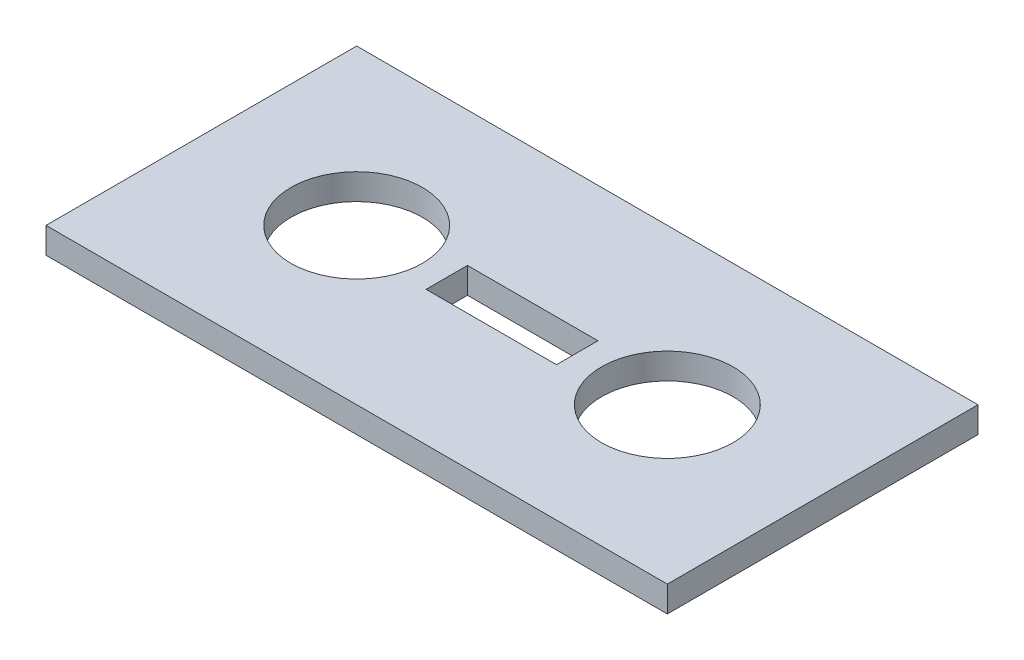
ISO-10303-21;
HEADER;
FILE_DESCRIPTION(('STEP AP214'),'2;1');
FILE_NAME('part.step','',(''),(''),'','','');
FILE_SCHEMA(('AUTOMOTIVE_DESIGN { 1 0 10303 214 1 1 1 1 }'));
ENDSEC;
DATA;
#1=APPLICATION_CONTEXT('core data for automotive mechanical design processes');
#2=APPLICATION_PROTOCOL_DEFINITION('international standard','automotive_design',2000,#1);
#3=PRODUCT_CONTEXT('',#1,'mechanical');
#4=PRODUCT('Part','Part','',(#3));
#5=PRODUCT_RELATED_PRODUCT_CATEGORY('part','',(#4));
#6=PRODUCT_DEFINITION_FORMATION('','',#4);
#7=PRODUCT_DEFINITION_CONTEXT('part definition',#1,'design');
#8=PRODUCT_DEFINITION('design','',#6,#7);
#9=PRODUCT_DEFINITION_SHAPE('','',#8);
#10=(LENGTH_UNIT() NAMED_UNIT(*) SI_UNIT(.MILLI.,.METRE.));
#11=(NAMED_UNIT(*) PLANE_ANGLE_UNIT() SI_UNIT($,.RADIAN.));
#12=(NAMED_UNIT(*) SI_UNIT($,.STERADIAN.) SOLID_ANGLE_UNIT());
#13=UNCERTAINTY_MEASURE_WITH_UNIT(LENGTH_MEASURE(1.E-05),#10,'distance_accuracy_value','');
#14=(GEOMETRIC_REPRESENTATION_CONTEXT(3) GLOBAL_UNCERTAINTY_ASSIGNED_CONTEXT((#13)) GLOBAL_UNIT_ASSIGNED_CONTEXT((#10,
#11,#12)) REPRESENTATION_CONTEXT('',''));
#15=CARTESIAN_POINT('',(0.,0.,0.));
#16=DIRECTION('',(0.,0.,1.));
#17=DIRECTION('',(1.,0.,0.));
#18=AXIS2_PLACEMENT_3D('',#15,#16,#17);
#19=CARTESIAN_POINT('',(0.,0.3175,0.254));
#20=DIRECTION('',(0.,0.,-1.));
#21=DIRECTION('',(-1.,0.,0.));
#22=AXIS2_PLACEMENT_3D('',#19,#20,#21);
#23=PLANE('',#22);
#24=DIRECTION('',(1.,0.,0.));
#25=VECTOR('',#24,1.);
#26=CARTESIAN_POINT('',(0.,0.,0.254));
#27=LINE('',#26,#25);
#28=CARTESIAN_POINT('',(-0.8,0.,0.254));
#29=VERTEX_POINT('',#28);
#30=CARTESIAN_POINT('',(0.8,0.,0.254));
#31=VERTEX_POINT('',#30);
#32=EDGE_CURVE('E169',#29,#31,#27,.T.);
#33=ORIENTED_EDGE('',*,*,#32,.F.);
#34=DIRECTION('',(0.,-1.,0.));
#35=VECTOR('',#34,1.);
#36=CARTESIAN_POINT('',(-0.8,0.3175,0.254));
#37=LINE('',#36,#35);
#38=CARTESIAN_POINT('',(-0.8,0.3175,0.254));
#39=VERTEX_POINT('',#38);
#40=EDGE_CURVE('E11',#39,#29,#37,.T.);
#41=ORIENTED_EDGE('',*,*,#40,.F.);
#42=DIRECTION('',(1.,0.,0.));
#43=VECTOR('',#42,1.);
#44=CARTESIAN_POINT('',(0.,0.3175,0.254));
#45=LINE('',#44,#43);
#46=CARTESIAN_POINT('',(0.8,0.3175,0.254));
#47=VERTEX_POINT('',#46);
#48=EDGE_CURVE('E140',#39,#47,#45,.T.);
#49=ORIENTED_EDGE('',*,*,#48,.T.);
#50=DIRECTION('',(0.,-1.,0.));
#51=VECTOR('',#50,1.);
#52=CARTESIAN_POINT('',(0.8,0.3175,0.254));
#53=LINE('',#52,#51);
#54=EDGE_CURVE('E98',#47,#31,#53,.T.);
#55=ORIENTED_EDGE('',*,*,#54,.T.);
#56=EDGE_LOOP('',(#33,#41,#49,#55));
#57=FACE_BOUND('',#56,.T.);
#58=ADVANCED_FACE('F43',(#57),#23,.T.);
#59=CARTESIAN_POINT('',(-0.8,0.3175,0.));
#60=DIRECTION('',(1.,0.,0.));
#61=DIRECTION('',(0.,0.,-1.));
#62=AXIS2_PLACEMENT_3D('',#59,#60,#61);
#63=PLANE('',#62);
#64=DIRECTION('',(0.,0.,1.));
#65=VECTOR('',#64,1.);
#66=CARTESIAN_POINT('',(-0.8,0.,0.));
#67=LINE('',#66,#65);
#68=CARTESIAN_POINT('',(-0.8,0.,-0.254));
#69=VERTEX_POINT('',#68);
#70=EDGE_CURVE('E128',#69,#29,#67,.T.);
#71=ORIENTED_EDGE('',*,*,#70,.F.);
#72=DIRECTION('',(0.,-1.,0.));
#73=VECTOR('',#72,1.);
#74=CARTESIAN_POINT('',(-0.8,0.3175,-0.254));
#75=LINE('',#74,#73);
#76=CARTESIAN_POINT('',(-0.8,0.3175,-0.254));
#77=VERTEX_POINT('',#76);
#78=EDGE_CURVE('E54',#77,#69,#75,.T.);
#79=ORIENTED_EDGE('',*,*,#78,.F.);
#80=DIRECTION('',(0.,0.,1.));
#81=VECTOR('',#80,1.);
#82=CARTESIAN_POINT('',(-0.8,0.3175,0.));
#83=LINE('',#82,#81);
#84=EDGE_CURVE('E126',#77,#39,#83,.T.);
#85=ORIENTED_EDGE('',*,*,#84,.T.);
#86=ORIENTED_EDGE('',*,*,#40,.T.);
#87=EDGE_LOOP('',(#71,#79,#85,#86));
#88=FACE_BOUND('',#87,.T.);
#89=ADVANCED_FACE('F124',(#88),#63,.T.);
#90=CARTESIAN_POINT('',(0.,0.3175,-0.254));
#91=DIRECTION('',(0.,0.,-1.));
#92=DIRECTION('',(-1.,0.,0.));
#93=AXIS2_PLACEMENT_3D('',#90,#91,#92);
#94=PLANE('',#93);
#95=DIRECTION('',(1.,0.,0.));
#96=VECTOR('',#95,1.);
#97=CARTESIAN_POINT('',(0.,0.,-0.254));
#98=LINE('',#97,#96);
#99=CARTESIAN_POINT('',(0.8,0.,-0.254));
#100=VERTEX_POINT('',#99);
#101=EDGE_CURVE('E174',#69,#100,#98,.T.);
#102=ORIENTED_EDGE('',*,*,#101,.T.);
#103=DIRECTION('',(0.,-1.,0.));
#104=VECTOR('',#103,1.);
#105=CARTESIAN_POINT('',(0.8,0.3175,-0.254));
#106=LINE('',#105,#104);
#107=CARTESIAN_POINT('',(0.8,0.3175,-0.254));
#108=VERTEX_POINT('',#107);
#109=EDGE_CURVE('E132',#108,#100,#106,.T.);
#110=ORIENTED_EDGE('',*,*,#109,.F.);
#111=DIRECTION('',(1.,0.,0.));
#112=VECTOR('',#111,1.);
#113=CARTESIAN_POINT('',(0.,0.3175,-0.254));
#114=LINE('',#113,#112);
#115=EDGE_CURVE('E135',#77,#108,#114,.T.);
#116=ORIENTED_EDGE('',*,*,#115,.F.);
#117=ORIENTED_EDGE('',*,*,#78,.T.);
#118=EDGE_LOOP('',(#102,#110,#116,#117));
#119=FACE_BOUND('',#118,.T.);
#120=ADVANCED_FACE('F136',(#119),#94,.F.);
#121=CARTESIAN_POINT('',(0.,0.3175,1.905));
#122=DIRECTION('',(0.,0.,-1.));
#123=DIRECTION('',(-1.,0.,0.));
#124=AXIS2_PLACEMENT_3D('',#121,#122,#123);
#125=PLANE('',#124);
#126=DIRECTION('',(1.,0.,0.));
#127=VECTOR('',#126,1.);
#128=CARTESIAN_POINT('',(0.,0.,1.905));
#129=LINE('',#128,#127);
#130=CARTESIAN_POINT('',(-3.81,0.,1.905));
#131=VERTEX_POINT('',#130);
#132=CARTESIAN_POINT('',(3.81,0.,1.905));
#133=VERTEX_POINT('',#132);
#134=EDGE_CURVE('E152',#131,#133,#129,.T.);
#135=ORIENTED_EDGE('',*,*,#134,.T.);
#136=DIRECTION('',(0.,-1.,0.));
#137=VECTOR('',#136,1.);
#138=CARTESIAN_POINT('',(3.81,0.3175,1.905));
#139=LINE('',#138,#137);
#140=CARTESIAN_POINT('',(3.81,0.3175,1.905));
#141=VERTEX_POINT('',#140);
#142=EDGE_CURVE('E181',#141,#133,#139,.T.);
#143=ORIENTED_EDGE('',*,*,#142,.F.);
#144=DIRECTION('',(1.,0.,0.));
#145=VECTOR('',#144,1.);
#146=CARTESIAN_POINT('',(0.,0.3175,1.905));
#147=LINE('',#146,#145);
#148=CARTESIAN_POINT('',(-3.81,0.3175,1.905));
#149=VERTEX_POINT('',#148);
#150=EDGE_CURVE('E106',#149,#141,#147,.T.);
#151=ORIENTED_EDGE('',*,*,#150,.F.);
#152=DIRECTION('',(0.,-1.,0.));
#153=VECTOR('',#152,1.);
#154=CARTESIAN_POINT('',(-3.81,0.3175,1.905));
#155=LINE('',#154,#153);
#156=EDGE_CURVE('E151',#149,#131,#155,.T.);
#157=ORIENTED_EDGE('',*,*,#156,.T.);
#158=EDGE_LOOP('',(#135,#143,#151,#157));
#159=FACE_BOUND('',#158,.T.);
#160=ADVANCED_FACE('F45',(#159),#125,.F.);
#161=CARTESIAN_POINT('',(3.81,0.3175,0.));
#162=DIRECTION('',(1.,0.,0.));
#163=DIRECTION('',(0.,0.,-1.));
#164=AXIS2_PLACEMENT_3D('',#161,#162,#163);
#165=PLANE('',#164);
#166=DIRECTION('',(0.,0.,1.));
#167=VECTOR('',#166,1.);
#168=CARTESIAN_POINT('',(3.81,0.,0.));
#169=LINE('',#168,#167);
#170=CARTESIAN_POINT('',(3.81,0.,-1.905));
#171=VERTEX_POINT('',#170);
#172=EDGE_CURVE('E156',#171,#133,#169,.T.);
#173=ORIENTED_EDGE('',*,*,#172,.F.);
#174=DIRECTION('',(0.,-1.,0.));
#175=VECTOR('',#174,1.);
#176=CARTESIAN_POINT('',(3.81,0.3175,-1.905));
#177=LINE('',#176,#175);
#178=CARTESIAN_POINT('',(3.81,0.3175,-1.905));
#179=VERTEX_POINT('',#178);
#180=EDGE_CURVE('E189',#179,#171,#177,.T.);
#181=ORIENTED_EDGE('',*,*,#180,.F.);
#182=DIRECTION('',(0.,0.,1.));
#183=VECTOR('',#182,1.);
#184=CARTESIAN_POINT('',(3.81,0.3175,0.));
#185=LINE('',#184,#183);
#186=EDGE_CURVE('E197',#179,#141,#185,.T.);
#187=ORIENTED_EDGE('',*,*,#186,.T.);
#188=ORIENTED_EDGE('',*,*,#142,.T.);
#189=EDGE_LOOP('',(#173,#181,#187,#188));
#190=FACE_BOUND('',#189,.T.);
#191=ADVANCED_FACE('F196',(#190),#165,.T.);
#192=CARTESIAN_POINT('',(0.,0.3175,-1.905));
#193=DIRECTION('',(0.,0.,-1.));
#194=DIRECTION('',(-1.,0.,0.));
#195=AXIS2_PLACEMENT_3D('',#192,#193,#194);
#196=PLANE('',#195);
#197=DIRECTION('',(1.,0.,0.));
#198=VECTOR('',#197,1.);
#199=CARTESIAN_POINT('',(0.,0.,-1.905));
#200=LINE('',#199,#198);
#201=CARTESIAN_POINT('',(-3.81,0.,-1.905));
#202=VERTEX_POINT('',#201);
#203=EDGE_CURVE('E161',#202,#171,#200,.T.);
#204=ORIENTED_EDGE('',*,*,#203,.F.);
#205=DIRECTION('',(0.,-1.,0.));
#206=VECTOR('',#205,1.);
#207=CARTESIAN_POINT('',(-3.81,0.3175,-1.905));
#208=LINE('',#207,#206);
#209=CARTESIAN_POINT('',(-3.81,0.3175,-1.905));
#210=VERTEX_POINT('',#209);
#211=EDGE_CURVE('E186',#210,#202,#208,.T.);
#212=ORIENTED_EDGE('',*,*,#211,.F.);
#213=DIRECTION('',(1.,0.,0.));
#214=VECTOR('',#213,1.);
#215=CARTESIAN_POINT('',(0.,0.3175,-1.905));
#216=LINE('',#215,#214);
#217=EDGE_CURVE('E208',#210,#179,#216,.T.);
#218=ORIENTED_EDGE('',*,*,#217,.T.);
#219=ORIENTED_EDGE('',*,*,#180,.T.);
#220=EDGE_LOOP('',(#204,#212,#218,#219));
#221=FACE_BOUND('',#220,.T.);
#222=ADVANCED_FACE('F205',(#221),#196,.T.);
#223=CARTESIAN_POINT('',(-3.81,0.3175,0.));
#224=DIRECTION('',(-1.,0.,0.));
#225=DIRECTION('',(0.,0.,1.));
#226=AXIS2_PLACEMENT_3D('',#223,#224,#225);
#227=PLANE('',#226);
#228=DIRECTION('',(0.,0.,-1.));
#229=VECTOR('',#228,1.);
#230=CARTESIAN_POINT('',(-3.81,0.,0.));
#231=LINE('',#230,#229);
#232=EDGE_CURVE('E165',#131,#202,#231,.T.);
#233=ORIENTED_EDGE('',*,*,#232,.F.);
#234=ORIENTED_EDGE('',*,*,#156,.F.);
#235=DIRECTION('',(0.,0.,-1.));
#236=VECTOR('',#235,1.);
#237=CARTESIAN_POINT('',(-3.81,0.3175,0.));
#238=LINE('',#237,#236);
#239=EDGE_CURVE('E145',#149,#210,#238,.T.);
#240=ORIENTED_EDGE('',*,*,#239,.T.);
#241=ORIENTED_EDGE('',*,*,#211,.T.);
#242=EDGE_LOOP('',(#233,#234,#240,#241));
#243=FACE_BOUND('',#242,.T.);
#244=ADVANCED_FACE('F221',(#243),#227,.T.);
#245=CARTESIAN_POINT('',(0.8,0.3175,0.));
#246=DIRECTION('',(1.,0.,0.));
#247=DIRECTION('',(0.,0.,-1.));
#248=AXIS2_PLACEMENT_3D('',#245,#246,#247);
#249=PLANE('',#248);
#250=DIRECTION('',(0.,0.,1.));
#251=VECTOR('',#250,1.);
#252=CARTESIAN_POINT('',(0.8,0.,0.));
#253=LINE('',#252,#251);
#254=EDGE_CURVE('E91',#100,#31,#253,.T.);
#255=ORIENTED_EDGE('',*,*,#254,.T.);
#256=ORIENTED_EDGE('',*,*,#54,.F.);
#257=DIRECTION('',(0.,0.,1.));
#258=VECTOR('',#257,1.);
#259=CARTESIAN_POINT('',(0.8,0.3175,0.));
#260=LINE('',#259,#258);
#261=EDGE_CURVE('E63',#108,#47,#260,.T.);
#262=ORIENTED_EDGE('',*,*,#261,.F.);
#263=ORIENTED_EDGE('',*,*,#109,.T.);
#264=EDGE_LOOP('',(#255,#256,#262,#263));
#265=FACE_BOUND('',#264,.T.);
#266=ADVANCED_FACE('F223',(#265),#249,.F.);
#267=CARTESIAN_POINT('',(0.,0.3175,0.));
#268=DIRECTION('',(0.,1.,0.));
#269=DIRECTION('',(0.,0.,1.));
#270=AXIS2_PLACEMENT_3D('',#267,#268,#269);
#271=PLANE('',#270);
#272=CARTESIAN_POINT('',(-1.905,0.317500000000002,0.));
#273=DIRECTION('',(0.,1.,0.));
#274=DIRECTION('',(0.,0.,1.));
#275=AXIS2_PLACEMENT_3D('',#272,#273,#274);
#276=CIRCLE('',#275,0.80644999999999);
#277=CARTESIAN_POINT('',(-1.905,0.317500000000002,0.80644999999999));
#278=VERTEX_POINT('',#277);
#279=EDGE_CURVE('E259',#278,#278,#276,.T.);
#280=ORIENTED_EDGE('',*,*,#279,.F.);
#281=EDGE_LOOP('',(#280));
#282=FACE_BOUND('',#281,.T.);
#283=CARTESIAN_POINT('',(1.905,0.317500000000002,0.));
#284=DIRECTION('',(0.,1.,0.));
#285=DIRECTION('',(0.,0.,1.));
#286=AXIS2_PLACEMENT_3D('',#283,#284,#285);
#287=CIRCLE('',#286,0.80644999999999);
#288=CARTESIAN_POINT('',(1.905,0.317500000000002,0.80644999999999));
#289=VERTEX_POINT('',#288);
#290=EDGE_CURVE('E263',#289,#289,#287,.T.);
#291=ORIENTED_EDGE('',*,*,#290,.F.);
#292=EDGE_LOOP('',(#291));
#293=FACE_BOUND('',#292,.T.);
#294=ORIENTED_EDGE('',*,*,#150,.T.);
#295=ORIENTED_EDGE('',*,*,#186,.F.);
#296=ORIENTED_EDGE('',*,*,#217,.F.);
#297=ORIENTED_EDGE('',*,*,#239,.F.);
#298=EDGE_LOOP('',(#294,#295,#296,#297));
#299=FACE_BOUND('',#298,.T.);
#300=ORIENTED_EDGE('',*,*,#48,.F.);
#301=ORIENTED_EDGE('',*,*,#84,.F.);
#302=ORIENTED_EDGE('',*,*,#115,.T.);
#303=ORIENTED_EDGE('',*,*,#261,.T.);
#304=EDGE_LOOP('',(#300,#301,#302,#303));
#305=FACE_BOUND('',#304,.T.);
#306=ADVANCED_FACE('F139',(#282,#293,#299,#305),#271,.T.);
#307=CARTESIAN_POINT('',(0.,0.,0.));
#308=DIRECTION('',(0.,1.,0.));
#309=DIRECTION('',(0.,0.,1.));
#310=AXIS2_PLACEMENT_3D('',#307,#308,#309);
#311=PLANE('',#310);
#312=CARTESIAN_POINT('',(-1.905,0.,0.));
#313=DIRECTION('',(0.,1.,0.));
#314=DIRECTION('',(0.,0.,1.));
#315=AXIS2_PLACEMENT_3D('',#312,#313,#314);
#316=CIRCLE('',#315,0.806449999999989);
#317=CARTESIAN_POINT('',(-1.905,0.,0.806449999999989));
#318=VERTEX_POINT('',#317);
#319=EDGE_CURVE('E47',#318,#318,#316,.T.);
#320=ORIENTED_EDGE('',*,*,#319,.T.);
#321=EDGE_LOOP('',(#320));
#322=FACE_BOUND('',#321,.T.);
#323=CARTESIAN_POINT('',(1.905,0.,0.));
#324=DIRECTION('',(0.,1.,0.));
#325=DIRECTION('',(0.,0.,1.));
#326=AXIS2_PLACEMENT_3D('',#323,#324,#325);
#327=CIRCLE('',#326,0.806449999999989);
#328=CARTESIAN_POINT('',(1.905,0.,0.806449999999989));
#329=VERTEX_POINT('',#328);
#330=EDGE_CURVE('E157',#329,#329,#327,.T.);
#331=ORIENTED_EDGE('',*,*,#330,.T.);
#332=EDGE_LOOP('',(#331));
#333=FACE_BOUND('',#332,.T.);
#334=ORIENTED_EDGE('',*,*,#134,.F.);
#335=ORIENTED_EDGE('',*,*,#232,.T.);
#336=ORIENTED_EDGE('',*,*,#203,.T.);
#337=ORIENTED_EDGE('',*,*,#172,.T.);
#338=EDGE_LOOP('',(#334,#335,#336,#337));
#339=FACE_BOUND('',#338,.T.);
#340=ORIENTED_EDGE('',*,*,#32,.T.);
#341=ORIENTED_EDGE('',*,*,#254,.F.);
#342=ORIENTED_EDGE('',*,*,#101,.F.);
#343=ORIENTED_EDGE('',*,*,#70,.T.);
#344=EDGE_LOOP('',(#340,#341,#342,#343));
#345=FACE_BOUND('',#344,.T.);
#346=ADVANCED_FACE('F202',(#322,#333,#339,#345),#311,.F.);
#347=CARTESIAN_POINT('',(1.905,0.3175,0.));
#348=DIRECTION('',(0.,1.,0.));
#349=DIRECTION('',(0.,0.,1.));
#350=AXIS2_PLACEMENT_3D('',#347,#348,#349);
#351=CYLINDRICAL_SURFACE('',#350,0.806449999999989);
#352=ORIENTED_EDGE('',*,*,#290,.T.);
#353=EDGE_LOOP('',(#352));
#354=FACE_BOUND('',#353,.T.);
#355=ORIENTED_EDGE('',*,*,#330,.F.);
#356=EDGE_LOOP('',(#355));
#357=FACE_BOUND('',#356,.T.);
#358=ADVANCED_FACE('F243',(#354,#357),#351,.F.);
#359=CARTESIAN_POINT('',(-1.905,0.3175,0.));
#360=DIRECTION('',(0.,1.,0.));
#361=DIRECTION('',(0.,0.,1.));
#362=AXIS2_PLACEMENT_3D('',#359,#360,#361);
#363=CYLINDRICAL_SURFACE('',#362,0.806449999999989);
#364=ORIENTED_EDGE('',*,*,#279,.T.);
#365=EDGE_LOOP('',(#364));
#366=FACE_BOUND('',#365,.T.);
#367=ORIENTED_EDGE('',*,*,#319,.F.);
#368=EDGE_LOOP('',(#367));
#369=FACE_BOUND('',#368,.T.);
#370=ADVANCED_FACE('F250',(#366,#369),#363,.F.);
#371=CLOSED_SHELL('',(#58,#89,#120,#160,#191,#222,#244,#266,#306,#346,#358,#370));
#372=MANIFOLD_SOLID_BREP('B2',#371);
#373=ADVANCED_BREP_SHAPE_REPRESENTATION('',(#18,#372),#14);
#374=SHAPE_DEFINITION_REPRESENTATION(#9,#373);
ENDSEC;
END-ISO-10303-21;
